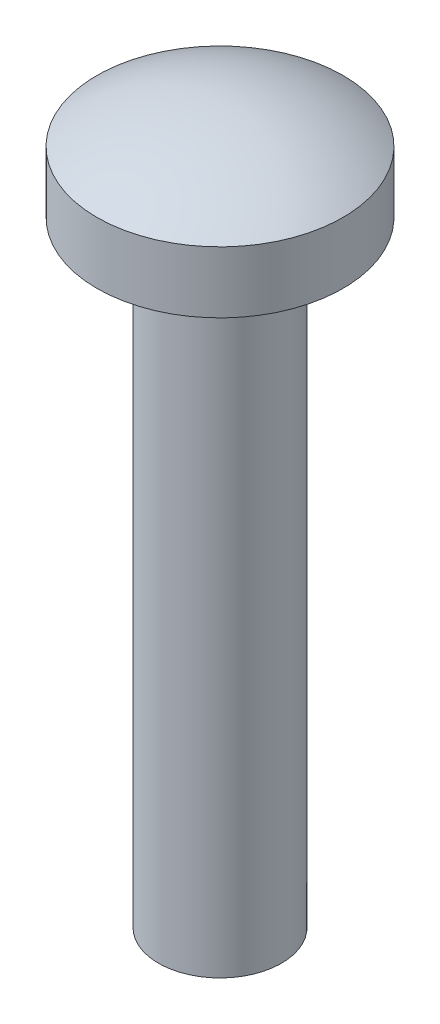
ISO-10303-21;
HEADER;
FILE_DESCRIPTION(('STEP AP214'),'2;1');
FILE_NAME('part.step','',(''),(''),'','','');
FILE_SCHEMA(('AUTOMOTIVE_DESIGN { 1 0 10303 214 1 1 1 1 }'));
ENDSEC;
DATA;
#1=APPLICATION_CONTEXT('core data for automotive mechanical design processes');
#2=APPLICATION_PROTOCOL_DEFINITION('international standard','automotive_design',2000,#1);
#3=PRODUCT_CONTEXT('',#1,'mechanical');
#4=PRODUCT('Part','Part','',(#3));
#5=PRODUCT_RELATED_PRODUCT_CATEGORY('part','',(#4));
#6=PRODUCT_DEFINITION_FORMATION('','',#4);
#7=PRODUCT_DEFINITION_CONTEXT('part definition',#1,'design');
#8=PRODUCT_DEFINITION('design','',#6,#7);
#9=PRODUCT_DEFINITION_SHAPE('','',#8);
#10=(LENGTH_UNIT() NAMED_UNIT(*) SI_UNIT(.MILLI.,.METRE.));
#11=(NAMED_UNIT(*) PLANE_ANGLE_UNIT() SI_UNIT($,.RADIAN.));
#12=(NAMED_UNIT(*) SI_UNIT($,.STERADIAN.) SOLID_ANGLE_UNIT());
#13=UNCERTAINTY_MEASURE_WITH_UNIT(LENGTH_MEASURE(1.E-05),#10,'distance_accuracy_value','');
#14=(GEOMETRIC_REPRESENTATION_CONTEXT(3) GLOBAL_UNCERTAINTY_ASSIGNED_CONTEXT((#13)) GLOBAL_UNIT_ASSIGNED_CONTEXT((#10,
#11,#12)) REPRESENTATION_CONTEXT('',''));
#15=CARTESIAN_POINT('',(0.,0.,0.));
#16=DIRECTION('',(0.,0.,1.));
#17=DIRECTION('',(1.,0.,0.));
#18=AXIS2_PLACEMENT_3D('',#15,#16,#17);
#19=CARTESIAN_POINT('',(0.,0.,0.));
#20=DIRECTION('',(0.,1.,0.));
#21=DIRECTION('',(0.,0.,1.));
#22=AXIS2_PLACEMENT_3D('',#19,#20,#21);
#23=PLANE('',#22);
#24=CARTESIAN_POINT('',(0.,0.,0.));
#25=DIRECTION('',(0.,-1.,0.));
#26=DIRECTION('',(0.,0.,-1.));
#27=AXIS2_PLACEMENT_3D('',#24,#25,#26);
#28=CIRCLE('',#27,1.);
#29=CARTESIAN_POINT('',(0.,0.,-1.));
#30=VERTEX_POINT('',#29);
#31=EDGE_CURVE('E10',#30,#30,#28,.T.);
#32=ORIENTED_EDGE('',*,*,#31,.F.);
#33=EDGE_LOOP('',(#32));
#34=FACE_BOUND('',#33,.T.);
#35=CARTESIAN_POINT('',(0.,0.,0.));
#36=DIRECTION('',(0.,1.,0.));
#37=DIRECTION('',(0.,0.,1.));
#38=AXIS2_PLACEMENT_3D('',#35,#36,#37);
#39=CIRCLE('',#38,2.);
#40=CARTESIAN_POINT('',(0.,0.,2.));
#41=VERTEX_POINT('',#40);
#42=EDGE_CURVE('E33',#41,#41,#39,.T.);
#43=ORIENTED_EDGE('',*,*,#42,.F.);
#44=EDGE_LOOP('',(#43));
#45=FACE_BOUND('',#44,.T.);
#46=ADVANCED_FACE('F30',(#34,#45),#23,.F.);
#47=CARTESIAN_POINT('',(0.,1.6,0.));
#48=DIRECTION('',(0.,1.,0.));
#49=DIRECTION('',(0.,0.,1.));
#50=AXIS2_PLACEMENT_3D('',#47,#48,#49);
#51=CYLINDRICAL_SURFACE('',#50,2.);
#52=CARTESIAN_POINT('',(0.,1.,0.));
#53=DIRECTION('',(0.,1.,0.));
#54=DIRECTION('',(0.,0.,1.));
#55=AXIS2_PLACEMENT_3D('',#52,#53,#54);
#56=CIRCLE('',#55,2.);
#57=CARTESIAN_POINT('',(0.,1.,2.));
#58=VERTEX_POINT('',#57);
#59=EDGE_CURVE('E41',#58,#58,#56,.T.);
#60=ORIENTED_EDGE('',*,*,#59,.F.);
#61=EDGE_LOOP('',(#60));
#62=FACE_BOUND('',#61,.T.);
#63=ORIENTED_EDGE('',*,*,#42,.T.);
#64=EDGE_LOOP('',(#63));
#65=FACE_BOUND('',#64,.T.);
#66=ADVANCED_FACE('F61',(#62,#65),#51,.T.);
#67=CARTESIAN_POINT('',(0.,-2.03333333333333,0.));
#68=DIRECTION('',(0.,1.,0.));
#69=DIRECTION('',(0.,0.,-1.));
#70=AXIS2_PLACEMENT_3D('',#67,#68,#69);
#71=SPHERICAL_SURFACE('',#70,3.63333333333333);
#72=ORIENTED_EDGE('',*,*,#59,.T.);
#73=EDGE_LOOP('',(#72));
#74=FACE_BOUND('',#73,.T.);
#75=ADVANCED_FACE('F54',(#74),#71,.T.);
#76=CARTESIAN_POINT('',(0.,-10.,0.));
#77=DIRECTION('',(0.,1.,0.));
#78=DIRECTION('',(0.,0.,1.));
#79=AXIS2_PLACEMENT_3D('',#76,#77,#78);
#80=CYLINDRICAL_SURFACE('',#79,1.);
#81=CARTESIAN_POINT('',(0.,-10.,0.));
#82=DIRECTION('',(0.,-1.,0.));
#83=DIRECTION('',(0.,0.,-1.));
#84=AXIS2_PLACEMENT_3D('',#81,#82,#83);
#85=CIRCLE('',#84,1.);
#86=CARTESIAN_POINT('',(0.,-10.,-1.));
#87=VERTEX_POINT('',#86);
#88=EDGE_CURVE('E43',#87,#87,#85,.T.);
#89=ORIENTED_EDGE('',*,*,#88,.F.);
#90=EDGE_LOOP('',(#89));
#91=FACE_BOUND('',#90,.T.);
#92=ORIENTED_EDGE('',*,*,#31,.T.);
#93=EDGE_LOOP('',(#92));
#94=FACE_BOUND('',#93,.T.);
#95=ADVANCED_FACE('F52',(#91,#94),#80,.T.);
#96=CARTESIAN_POINT('',(0.,-10.,0.));
#97=DIRECTION('',(0.,-1.,0.));
#98=DIRECTION('',(0.,0.,-1.));
#99=AXIS2_PLACEMENT_3D('',#96,#97,#98);
#100=PLANE('',#99);
#101=ORIENTED_EDGE('',*,*,#88,.T.);
#102=EDGE_LOOP('',(#101));
#103=FACE_BOUND('',#102,.T.);
#104=ADVANCED_FACE('F50',(#103),#100,.T.);
#105=CLOSED_SHELL('',(#46,#66,#75,#95,#104));
#106=MANIFOLD_SOLID_BREP('B2',#105);
#107=ADVANCED_BREP_SHAPE_REPRESENTATION('',(#18,#106),#14);
#108=SHAPE_DEFINITION_REPRESENTATION(#9,#107);
ENDSEC;
END-ISO-10303-21;
